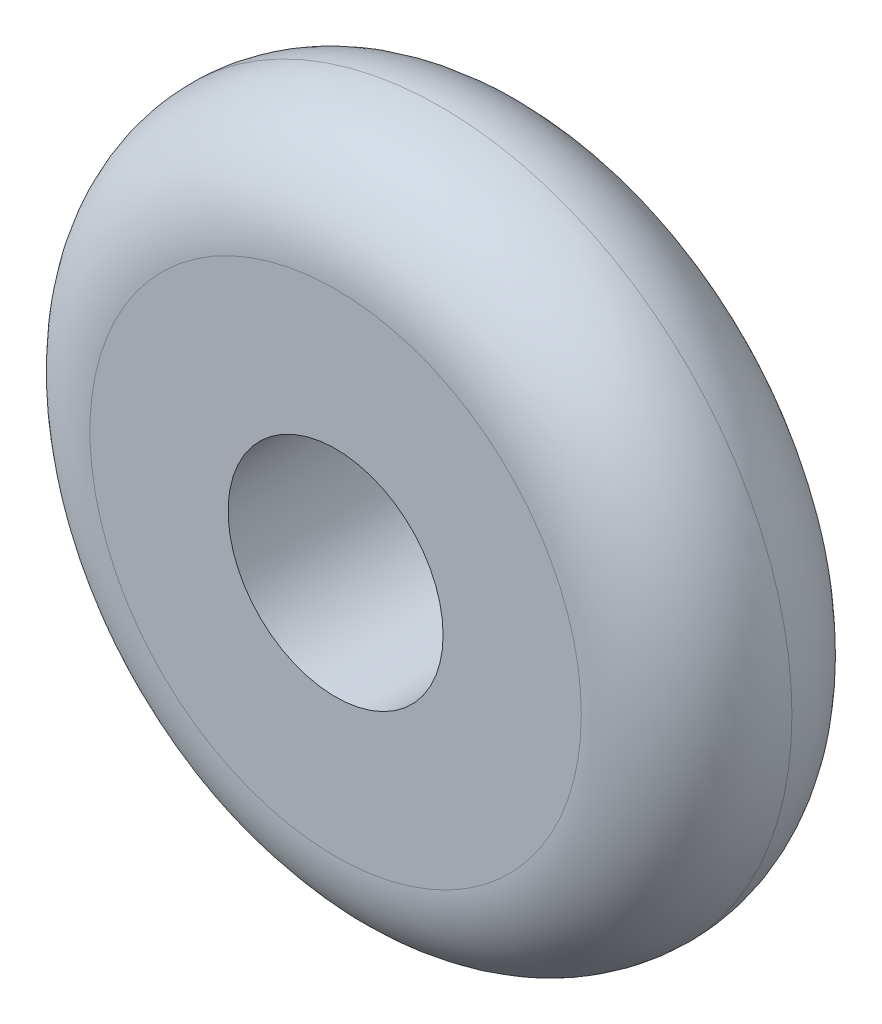
ISO-10303-21;
HEADER;
FILE_DESCRIPTION(('STEP AP214'),'2;1');
FILE_NAME('part.step','',(''),(''),'','','');
FILE_SCHEMA(('AUTOMOTIVE_DESIGN { 1 0 10303 214 1 1 1 1 }'));
ENDSEC;
DATA;
#1=APPLICATION_CONTEXT('core data for automotive mechanical design processes');
#2=APPLICATION_PROTOCOL_DEFINITION('international standard','automotive_design',2000,#1);
#3=PRODUCT_CONTEXT('',#1,'mechanical');
#4=PRODUCT('Part','Part','',(#3));
#5=PRODUCT_RELATED_PRODUCT_CATEGORY('part','',(#4));
#6=PRODUCT_DEFINITION_FORMATION('','',#4);
#7=PRODUCT_DEFINITION_CONTEXT('part definition',#1,'design');
#8=PRODUCT_DEFINITION('design','',#6,#7);
#9=PRODUCT_DEFINITION_SHAPE('','',#8);
#10=(LENGTH_UNIT() NAMED_UNIT(*) SI_UNIT(.MILLI.,.METRE.));
#11=(NAMED_UNIT(*) PLANE_ANGLE_UNIT() SI_UNIT($,.RADIAN.));
#12=(NAMED_UNIT(*) SI_UNIT($,.STERADIAN.) SOLID_ANGLE_UNIT());
#13=UNCERTAINTY_MEASURE_WITH_UNIT(LENGTH_MEASURE(1.E-05),#10,'distance_accuracy_value','');
#14=(GEOMETRIC_REPRESENTATION_CONTEXT(3) GLOBAL_UNCERTAINTY_ASSIGNED_CONTEXT((#13)) GLOBAL_UNIT_ASSIGNED_CONTEXT((#10,
#11,#12)) REPRESENTATION_CONTEXT('',''));
#15=CARTESIAN_POINT('',(0.,0.,0.));
#16=DIRECTION('',(0.,0.,1.));
#17=DIRECTION('',(1.,0.,0.));
#18=AXIS2_PLACEMENT_3D('',#15,#16,#17);
#19=CARTESIAN_POINT('',(0.,0.,24.));
#20=DIRECTION('',(0.,0.,1.));
#21=DIRECTION('',(1.,0.,0.));
#22=AXIS2_PLACEMENT_3D('',#19,#20,#21);
#23=PLANE('',#22);
#24=CARTESIAN_POINT('',(0.,0.,24.));
#25=DIRECTION('',(0.,0.,1.));
#26=DIRECTION('',(1.,0.,0.));
#27=AXIS2_PLACEMENT_3D('',#24,#25,#26);
#28=CIRCLE('',#27,28.);
#29=CARTESIAN_POINT('',(28.,0.,24.));
#30=VERTEX_POINT('',#29);
#31=EDGE_CURVE('E10',#30,#30,#28,.T.);
#32=ORIENTED_EDGE('',*,*,#31,.T.);
#33=EDGE_LOOP('',(#32));
#34=FACE_BOUND('',#33,.T.);
#35=CARTESIAN_POINT('',(0.,0.,24.));
#36=DIRECTION('',(0.,0.,1.));
#37=DIRECTION('',(1.,0.,0.));
#38=AXIS2_PLACEMENT_3D('',#35,#36,#37);
#39=CIRCLE('',#38,12.25);
#40=CARTESIAN_POINT('',(12.25,0.,24.));
#41=VERTEX_POINT('',#40);
#42=EDGE_CURVE('E57',#41,#41,#39,.T.);
#43=ORIENTED_EDGE('',*,*,#42,.F.);
#44=EDGE_LOOP('',(#43));
#45=FACE_BOUND('',#44,.T.);
#46=ADVANCED_FACE('F43',(#34,#45),#23,.T.);
#47=CARTESIAN_POINT('',(0.,0.,0.));
#48=DIRECTION('',(0.,0.,1.));
#49=DIRECTION('',(1.,0.,0.));
#50=AXIS2_PLACEMENT_3D('',#47,#48,#49);
#51=PLANE('',#50);
#52=CARTESIAN_POINT('',(0.,0.,0.));
#53=DIRECTION('',(0.,0.,1.));
#54=DIRECTION('',(1.,0.,0.));
#55=AXIS2_PLACEMENT_3D('',#52,#53,#54);
#56=CIRCLE('',#55,28.);
#57=CARTESIAN_POINT('',(28.,0.,0.));
#58=VERTEX_POINT('',#57);
#59=EDGE_CURVE('E52',#58,#58,#56,.F.);
#60=ORIENTED_EDGE('',*,*,#59,.T.);
#61=EDGE_LOOP('',(#60));
#62=FACE_BOUND('',#61,.T.);
#63=CARTESIAN_POINT('',(0.,0.,0.));
#64=DIRECTION('',(0.,0.,1.));
#65=DIRECTION('',(1.,0.,0.));
#66=AXIS2_PLACEMENT_3D('',#63,#64,#65);
#67=CIRCLE('',#66,12.25);
#68=CARTESIAN_POINT('',(12.25,0.,0.));
#69=VERTEX_POINT('',#68);
#70=EDGE_CURVE('E60',#69,#69,#67,.T.);
#71=ORIENTED_EDGE('',*,*,#70,.T.);
#72=EDGE_LOOP('',(#71));
#73=FACE_BOUND('',#72,.T.);
#74=ADVANCED_FACE('F72',(#62,#73),#51,.F.);
#75=CARTESIAN_POINT('',(0.,0.,24.));
#76=DIRECTION('',(0.,0.,-1.));
#77=DIRECTION('',(-1.,0.,0.));
#78=AXIS2_PLACEMENT_3D('',#75,#76,#77);
#79=CYLINDRICAL_SURFACE('',#78,12.25);
#80=ORIENTED_EDGE('',*,*,#42,.T.);
#81=EDGE_LOOP('',(#80));
#82=FACE_BOUND('',#81,.T.);
#83=ORIENTED_EDGE('',*,*,#70,.F.);
#84=EDGE_LOOP('',(#83));
#85=FACE_BOUND('',#84,.T.);
#86=ADVANCED_FACE('F68',(#82,#85),#79,.F.);
#87=CARTESIAN_POINT('',(0.,0.,12.));
#88=DIRECTION('',(0.,0.,1.));
#89=DIRECTION('',(1.,0.,0.));
#90=AXIS2_PLACEMENT_3D('',#87,#88,#89);
#91=TOROIDAL_SURFACE('',#90,28.,12.);
#92=ORIENTED_EDGE('',*,*,#31,.F.);
#93=EDGE_LOOP('',(#92));
#94=FACE_BOUND('',#93,.T.);
#95=CARTESIAN_POINT('',(0.,0.,12.));
#96=DIRECTION('',(0.,0.,1.));
#97=DIRECTION('',(1.,0.,0.));
#98=AXIS2_PLACEMENT_3D('',#95,#96,#97);
#99=CIRCLE('',#98,40.);
#100=CARTESIAN_POINT('',(40.,0.,12.));
#101=VERTEX_POINT('',#100);
#102=EDGE_CURVE('E47',#101,#101,#99,.F.);
#103=ORIENTED_EDGE('',*,*,#102,.F.);
#104=EDGE_LOOP('',(#103));
#105=FACE_BOUND('',#104,.T.);
#106=ADVANCED_FACE('F45',(#94,#105),#91,.T.);
#107=CARTESIAN_POINT('',(0.,0.,12.));
#108=DIRECTION('',(0.,0.,1.));
#109=DIRECTION('',(1.,0.,0.));
#110=AXIS2_PLACEMENT_3D('',#107,#108,#109);
#111=TOROIDAL_SURFACE('',#110,28.,12.);
#112=ORIENTED_EDGE('',*,*,#59,.F.);
#113=EDGE_LOOP('',(#112));
#114=FACE_BOUND('',#113,.T.);
#115=ORIENTED_EDGE('',*,*,#102,.T.);
#116=EDGE_LOOP('',(#115));
#117=FACE_BOUND('',#116,.T.);
#118=ADVANCED_FACE('F81',(#114,#117),#111,.T.);
#119=CLOSED_SHELL('',(#46,#74,#86,#106,#118));
#120=MANIFOLD_SOLID_BREP('B2',#119);
#121=ADVANCED_BREP_SHAPE_REPRESENTATION('',(#18,#120),#14);
#122=SHAPE_DEFINITION_REPRESENTATION(#9,#121);
ENDSEC;
END-ISO-10303-21;
